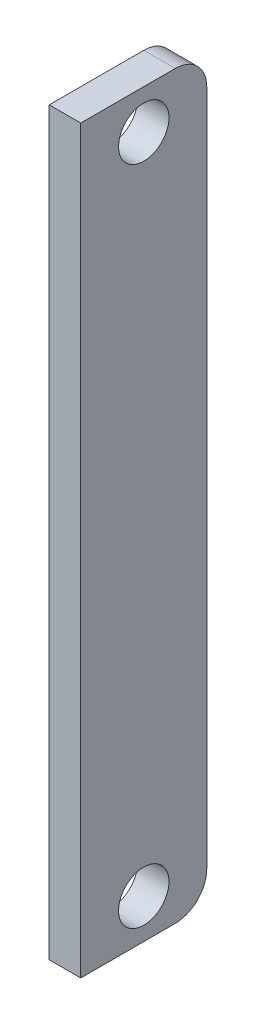
ISO-10303-21;
HEADER;
FILE_DESCRIPTION(('STEP AP214'),'2;1');
FILE_NAME('part.step','',(''),(''),'','','');
FILE_SCHEMA(('AUTOMOTIVE_DESIGN { 1 0 10303 214 1 1 1 1 }'));
ENDSEC;
DATA;
#1=APPLICATION_CONTEXT('core data for automotive mechanical design processes');
#2=APPLICATION_PROTOCOL_DEFINITION('international standard','automotive_design',2000,#1);
#3=PRODUCT_CONTEXT('',#1,'mechanical');
#4=PRODUCT('Part','Part','',(#3));
#5=PRODUCT_RELATED_PRODUCT_CATEGORY('part','',(#4));
#6=PRODUCT_DEFINITION_FORMATION('','',#4);
#7=PRODUCT_DEFINITION_CONTEXT('part definition',#1,'design');
#8=PRODUCT_DEFINITION('design','',#6,#7);
#9=PRODUCT_DEFINITION_SHAPE('','',#8);
#10=(LENGTH_UNIT() NAMED_UNIT(*) SI_UNIT(.MILLI.,.METRE.));
#11=(NAMED_UNIT(*) PLANE_ANGLE_UNIT() SI_UNIT($,.RADIAN.));
#12=(NAMED_UNIT(*) SI_UNIT($,.STERADIAN.) SOLID_ANGLE_UNIT());
#13=UNCERTAINTY_MEASURE_WITH_UNIT(LENGTH_MEASURE(1.E-05),#10,'distance_accuracy_value','');
#14=(GEOMETRIC_REPRESENTATION_CONTEXT(3) GLOBAL_UNCERTAINTY_ASSIGNED_CONTEXT((#13)) GLOBAL_UNIT_ASSIGNED_CONTEXT((#10,
#11,#12)) REPRESENTATION_CONTEXT('',''));
#15=CARTESIAN_POINT('',(0.,0.,0.));
#16=DIRECTION('',(0.,0.,1.));
#17=DIRECTION('',(1.,0.,0.));
#18=AXIS2_PLACEMENT_3D('',#15,#16,#17);
#19=CARTESIAN_POINT('',(10.,117.5,-20.));
#20=DIRECTION('',(0.,0.,1.));
#21=DIRECTION('',(0.,-1.,0.));
#22=AXIS2_PLACEMENT_3D('',#19,#20,#21);
#23=PLANE('',#22);
#24=DIRECTION('',(0.,1.,0.));
#25=VECTOR('',#24,1.);
#26=CARTESIAN_POINT('',(10.,117.5,-20.));
#27=LINE('',#26,#25);
#28=CARTESIAN_POINT('',(10.,-107.5,-20.));
#29=VERTEX_POINT('',#28);
#30=CARTESIAN_POINT('',(10.,107.5,-20.));
#31=VERTEX_POINT('',#30);
#32=EDGE_CURVE('E94',#29,#31,#27,.T.);
#33=ORIENTED_EDGE('',*,*,#32,.F.);
#34=DIRECTION('',(-1.,0.,0.));
#35=VECTOR('',#34,1.);
#36=CARTESIAN_POINT('',(10.,-107.5,-20.));
#37=LINE('',#36,#35);
#38=CARTESIAN_POINT('',(0.,-107.5,-20.));
#39=VERTEX_POINT('',#38);
#40=EDGE_CURVE('E124',#29,#39,#37,.T.);
#41=ORIENTED_EDGE('',*,*,#40,.T.);
#42=DIRECTION('',(0.,1.,0.));
#43=VECTOR('',#42,1.);
#44=CARTESIAN_POINT('',(0.,117.5,-20.));
#45=LINE('',#44,#43);
#46=CARTESIAN_POINT('',(0.,107.5,-20.));
#47=VERTEX_POINT('',#46);
#48=EDGE_CURVE('E113',#39,#47,#45,.T.);
#49=ORIENTED_EDGE('',*,*,#48,.T.);
#50=DIRECTION('',(-1.,0.,0.));
#51=VECTOR('',#50,1.);
#52=CARTESIAN_POINT('',(10.,107.5,-20.));
#53=LINE('',#52,#51);
#54=EDGE_CURVE('E103',#47,#31,#53,.F.);
#55=ORIENTED_EDGE('',*,*,#54,.T.);
#56=EDGE_LOOP('',(#33,#41,#49,#55));
#57=FACE_BOUND('',#56,.T.);
#58=ADVANCED_FACE('F33',(#57),#23,.F.);
#59=CARTESIAN_POINT('',(10.,117.5,20.));
#60=DIRECTION('',(0.,-1.,0.));
#61=DIRECTION('',(0.,0.,-1.));
#62=AXIS2_PLACEMENT_3D('',#59,#60,#61);
#63=PLANE('',#62);
#64=DIRECTION('',(0.,0.,1.));
#65=VECTOR('',#64,1.);
#66=CARTESIAN_POINT('',(10.,117.5,20.));
#67=LINE('',#66,#65);
#68=CARTESIAN_POINT('',(10.,117.5,-9.99999999999998));
#69=VERTEX_POINT('',#68);
#70=CARTESIAN_POINT('',(10.,117.5,20.));
#71=VERTEX_POINT('',#70);
#72=EDGE_CURVE('E86',#69,#71,#67,.T.);
#73=ORIENTED_EDGE('',*,*,#72,.F.);
#74=DIRECTION('',(-1.,0.,0.));
#75=VECTOR('',#74,1.);
#76=CARTESIAN_POINT('',(10.,117.5,-9.99999999999998));
#77=LINE('',#76,#75);
#78=CARTESIAN_POINT('',(0.,117.5,-9.99999999999998));
#79=VERTEX_POINT('',#78);
#80=EDGE_CURVE('E11',#69,#79,#77,.T.);
#81=ORIENTED_EDGE('',*,*,#80,.T.);
#82=DIRECTION('',(0.,0.,1.));
#83=VECTOR('',#82,1.);
#84=CARTESIAN_POINT('',(0.,117.5,20.));
#85=LINE('',#84,#83);
#86=CARTESIAN_POINT('',(0.,117.5,20.));
#87=VERTEX_POINT('',#86);
#88=EDGE_CURVE('E100',#79,#87,#85,.T.);
#89=ORIENTED_EDGE('',*,*,#88,.T.);
#90=DIRECTION('',(-1.,0.,0.));
#91=VECTOR('',#90,1.);
#92=CARTESIAN_POINT('',(10.,117.5,20.));
#93=LINE('',#92,#91);
#94=EDGE_CURVE('E97',#71,#87,#93,.T.);
#95=ORIENTED_EDGE('',*,*,#94,.F.);
#96=EDGE_LOOP('',(#73,#81,#89,#95));
#97=FACE_BOUND('',#96,.T.);
#98=ADVANCED_FACE('F98',(#97),#63,.F.);
#99=CARTESIAN_POINT('',(10.,117.5,20.));
#100=DIRECTION('',(0.,0.,-1.));
#101=DIRECTION('',(0.,1.,0.));
#102=AXIS2_PLACEMENT_3D('',#99,#100,#101);
#103=PLANE('',#102);
#104=DIRECTION('',(0.,-1.,0.));
#105=VECTOR('',#104,1.);
#106=CARTESIAN_POINT('',(0.,117.5,20.));
#107=LINE('',#106,#105);
#108=CARTESIAN_POINT('',(0.,-117.5,20.));
#109=VERTEX_POINT('',#108);
#110=EDGE_CURVE('E118',#87,#109,#107,.T.);
#111=ORIENTED_EDGE('',*,*,#110,.T.);
#112=DIRECTION('',(-1.,0.,0.));
#113=VECTOR('',#112,1.);
#114=CARTESIAN_POINT('',(10.,-117.5,20.));
#115=LINE('',#114,#113);
#116=CARTESIAN_POINT('',(10.,-117.5,20.));
#117=VERTEX_POINT('',#116);
#118=EDGE_CURVE('E104',#117,#109,#115,.T.);
#119=ORIENTED_EDGE('',*,*,#118,.F.);
#120=DIRECTION('',(0.,-1.,0.));
#121=VECTOR('',#120,1.);
#122=CARTESIAN_POINT('',(10.,117.5,20.));
#123=LINE('',#122,#121);
#124=EDGE_CURVE('E90',#71,#117,#123,.T.);
#125=ORIENTED_EDGE('',*,*,#124,.F.);
#126=ORIENTED_EDGE('',*,*,#94,.T.);
#127=EDGE_LOOP('',(#111,#119,#125,#126));
#128=FACE_BOUND('',#127,.T.);
#129=ADVANCED_FACE('F106',(#128),#103,.F.);
#130=CARTESIAN_POINT('',(10.,-117.5,20.));
#131=DIRECTION('',(0.,1.,0.));
#132=DIRECTION('',(0.,0.,1.));
#133=AXIS2_PLACEMENT_3D('',#130,#131,#132);
#134=PLANE('',#133);
#135=DIRECTION('',(0.,0.,-1.));
#136=VECTOR('',#135,1.);
#137=CARTESIAN_POINT('',(0.,-117.5,20.));
#138=LINE('',#137,#136);
#139=CARTESIAN_POINT('',(0.,-117.5,-10.));
#140=VERTEX_POINT('',#139);
#141=EDGE_CURVE('E120',#109,#140,#138,.T.);
#142=ORIENTED_EDGE('',*,*,#141,.T.);
#143=DIRECTION('',(-1.,0.,0.));
#144=VECTOR('',#143,1.);
#145=CARTESIAN_POINT('',(10.,-117.5,-10.));
#146=LINE('',#145,#144);
#147=CARTESIAN_POINT('',(10.,-117.5,-10.));
#148=VERTEX_POINT('',#147);
#149=EDGE_CURVE('E56',#140,#148,#146,.F.);
#150=ORIENTED_EDGE('',*,*,#149,.T.);
#151=DIRECTION('',(0.,0.,-1.));
#152=VECTOR('',#151,1.);
#153=CARTESIAN_POINT('',(10.,-117.5,20.));
#154=LINE('',#153,#152);
#155=EDGE_CURVE('E108',#117,#148,#154,.T.);
#156=ORIENTED_EDGE('',*,*,#155,.F.);
#157=ORIENTED_EDGE('',*,*,#118,.T.);
#158=EDGE_LOOP('',(#142,#150,#156,#157));
#159=FACE_BOUND('',#158,.T.);
#160=ADVANCED_FACE('F143',(#159),#134,.F.);
#161=CARTESIAN_POINT('',(10.,0.,0.));
#162=DIRECTION('',(1.,0.,0.));
#163=DIRECTION('',(0.,0.,-1.));
#164=AXIS2_PLACEMENT_3D('',#161,#162,#163);
#165=PLANE('',#164);
#166=CARTESIAN_POINT('',(10.,-105.,0.));
#167=DIRECTION('',(1.,0.,0.));
#168=DIRECTION('',(0.,0.,-1.));
#169=AXIS2_PLACEMENT_3D('',#166,#167,#168);
#170=CIRCLE('',#169,8.);
#171=CARTESIAN_POINT('',(10.,-105.,-8.00000000000003));
#172=VERTEX_POINT('',#171);
#173=EDGE_CURVE('E191',#172,#172,#170,.T.);
#174=ORIENTED_EDGE('',*,*,#173,.F.);
#175=EDGE_LOOP('',(#174));
#176=FACE_BOUND('',#175,.T.);
#177=CARTESIAN_POINT('',(10.,105.,0.));
#178=DIRECTION('',(1.,0.,0.));
#179=DIRECTION('',(0.,0.,-1.));
#180=AXIS2_PLACEMENT_3D('',#177,#178,#179);
#181=CIRCLE('',#180,8.);
#182=CARTESIAN_POINT('',(10.,105.,-8.00000000000001));
#183=VERTEX_POINT('',#182);
#184=EDGE_CURVE('E186',#183,#183,#181,.T.);
#185=ORIENTED_EDGE('',*,*,#184,.F.);
#186=EDGE_LOOP('',(#185));
#187=FACE_BOUND('',#186,.T.);
#188=ORIENTED_EDGE('',*,*,#155,.T.);
#189=CARTESIAN_POINT('',(10.,-107.5,-10.));
#190=DIRECTION('',(1.,0.,0.));
#191=DIRECTION('',(0.,0.,-1.));
#192=AXIS2_PLACEMENT_3D('',#189,#190,#191);
#193=CIRCLE('',#192,10.);
#194=EDGE_CURVE('E41',#148,#29,#193,.T.);
#195=ORIENTED_EDGE('',*,*,#194,.T.);
#196=ORIENTED_EDGE('',*,*,#32,.T.);
#197=CARTESIAN_POINT('',(10.,107.5,-9.99999999999998));
#198=DIRECTION('',(1.,0.,0.));
#199=DIRECTION('',(0.,0.,-1.));
#200=AXIS2_PLACEMENT_3D('',#197,#198,#199);
#201=CIRCLE('',#200,10.);
#202=EDGE_CURVE('E48',#31,#69,#201,.T.);
#203=ORIENTED_EDGE('',*,*,#202,.T.);
#204=ORIENTED_EDGE('',*,*,#72,.T.);
#205=ORIENTED_EDGE('',*,*,#124,.T.);
#206=EDGE_LOOP('',(#188,#195,#196,#203,#204,#205));
#207=FACE_BOUND('',#206,.T.);
#208=ADVANCED_FACE('F88',(#176,#187,#207),#165,.T.);
#209=CARTESIAN_POINT('',(0.,0.,0.));
#210=DIRECTION('',(1.,0.,0.));
#211=DIRECTION('',(0.,0.,-1.));
#212=AXIS2_PLACEMENT_3D('',#209,#210,#211);
#213=PLANE('',#212);
#214=CARTESIAN_POINT('',(0.,-105.,0.));
#215=DIRECTION('',(1.,0.,0.));
#216=DIRECTION('',(0.,0.,-1.));
#217=AXIS2_PLACEMENT_3D('',#214,#215,#216);
#218=CIRCLE('',#217,8.);
#219=CARTESIAN_POINT('',(0.,-105.,-8.00000000000003));
#220=VERTEX_POINT('',#219);
#221=EDGE_CURVE('E183',#220,#220,#218,.T.);
#222=ORIENTED_EDGE('',*,*,#221,.T.);
#223=EDGE_LOOP('',(#222));
#224=FACE_BOUND('',#223,.T.);
#225=CARTESIAN_POINT('',(0.,105.,0.));
#226=DIRECTION('',(1.,0.,0.));
#227=DIRECTION('',(0.,0.,-1.));
#228=AXIS2_PLACEMENT_3D('',#225,#226,#227);
#229=CIRCLE('',#228,8.);
#230=CARTESIAN_POINT('',(0.,105.,-8.00000000000001));
#231=VERTEX_POINT('',#230);
#232=EDGE_CURVE('E116',#231,#231,#229,.T.);
#233=ORIENTED_EDGE('',*,*,#232,.T.);
#234=EDGE_LOOP('',(#233));
#235=FACE_BOUND('',#234,.T.);
#236=ORIENTED_EDGE('',*,*,#48,.F.);
#237=CARTESIAN_POINT('',(0.,-107.5,-10.));
#238=DIRECTION('',(1.,0.,0.));
#239=DIRECTION('',(0.,0.,-1.));
#240=AXIS2_PLACEMENT_3D('',#237,#238,#239);
#241=CIRCLE('',#240,10.);
#242=EDGE_CURVE('E129',#39,#140,#241,.F.);
#243=ORIENTED_EDGE('',*,*,#242,.T.);
#244=ORIENTED_EDGE('',*,*,#141,.F.);
#245=ORIENTED_EDGE('',*,*,#110,.F.);
#246=ORIENTED_EDGE('',*,*,#88,.F.);
#247=CARTESIAN_POINT('',(0.,107.5,-9.99999999999998));
#248=DIRECTION('',(1.,0.,0.));
#249=DIRECTION('',(0.,0.,-1.));
#250=AXIS2_PLACEMENT_3D('',#247,#248,#249);
#251=CIRCLE('',#250,10.);
#252=EDGE_CURVE('E127',#79,#47,#251,.F.);
#253=ORIENTED_EDGE('',*,*,#252,.T.);
#254=EDGE_LOOP('',(#236,#243,#244,#245,#246,#253));
#255=FACE_BOUND('',#254,.T.);
#256=ADVANCED_FACE('F142',(#224,#235,#255),#213,.F.);
#257=CARTESIAN_POINT('',(0.,105.,0.));
#258=DIRECTION('',(1.,0.,0.));
#259=DIRECTION('',(0.,0.,-1.));
#260=AXIS2_PLACEMENT_3D('',#257,#258,#259);
#261=CYLINDRICAL_SURFACE('',#260,8.);
#262=ORIENTED_EDGE('',*,*,#232,.F.);
#263=EDGE_LOOP('',(#262));
#264=FACE_BOUND('',#263,.T.);
#265=ORIENTED_EDGE('',*,*,#184,.T.);
#266=EDGE_LOOP('',(#265));
#267=FACE_BOUND('',#266,.T.);
#268=ADVANCED_FACE('F167',(#264,#267),#261,.F.);
#269=CARTESIAN_POINT('',(0.,-105.,0.));
#270=DIRECTION('',(1.,0.,0.));
#271=DIRECTION('',(0.,0.,-1.));
#272=AXIS2_PLACEMENT_3D('',#269,#270,#271);
#273=CYLINDRICAL_SURFACE('',#272,8.);
#274=ORIENTED_EDGE('',*,*,#221,.F.);
#275=EDGE_LOOP('',(#274));
#276=FACE_BOUND('',#275,.T.);
#277=ORIENTED_EDGE('',*,*,#173,.T.);
#278=EDGE_LOOP('',(#277));
#279=FACE_BOUND('',#278,.T.);
#280=ADVANCED_FACE('F161',(#276,#279),#273,.F.);
#281=CARTESIAN_POINT('',(10.,-107.5,-10.));
#282=DIRECTION('',(-1.,0.,0.));
#283=DIRECTION('',(0.,0.,1.));
#284=AXIS2_PLACEMENT_3D('',#281,#282,#283);
#285=CYLINDRICAL_SURFACE('',#284,10.);
#286=ORIENTED_EDGE('',*,*,#194,.F.);
#287=ORIENTED_EDGE('',*,*,#149,.F.);
#288=ORIENTED_EDGE('',*,*,#242,.F.);
#289=ORIENTED_EDGE('',*,*,#40,.F.);
#290=EDGE_LOOP('',(#286,#287,#288,#289));
#291=FACE_BOUND('',#290,.T.);
#292=ADVANCED_FACE('F139',(#291),#285,.T.);
#293=CARTESIAN_POINT('',(10.,107.5,-9.99999999999998));
#294=DIRECTION('',(-1.,0.,0.));
#295=DIRECTION('',(0.,0.,1.));
#296=AXIS2_PLACEMENT_3D('',#293,#294,#295);
#297=CYLINDRICAL_SURFACE('',#296,10.);
#298=ORIENTED_EDGE('',*,*,#202,.F.);
#299=ORIENTED_EDGE('',*,*,#54,.F.);
#300=ORIENTED_EDGE('',*,*,#252,.F.);
#301=ORIENTED_EDGE('',*,*,#80,.F.);
#302=EDGE_LOOP('',(#298,#299,#300,#301));
#303=FACE_BOUND('',#302,.T.);
#304=ADVANCED_FACE('F35',(#303),#297,.T.);
#305=CLOSED_SHELL('',(#58,#98,#129,#160,#208,#256,#268,#280,#292,#304));
#306=MANIFOLD_SOLID_BREP('B2',#305);
#307=ADVANCED_BREP_SHAPE_REPRESENTATION('',(#18,#306),#14);
#308=SHAPE_DEFINITION_REPRESENTATION(#9,#307);
ENDSEC;
END-ISO-10303-21;
